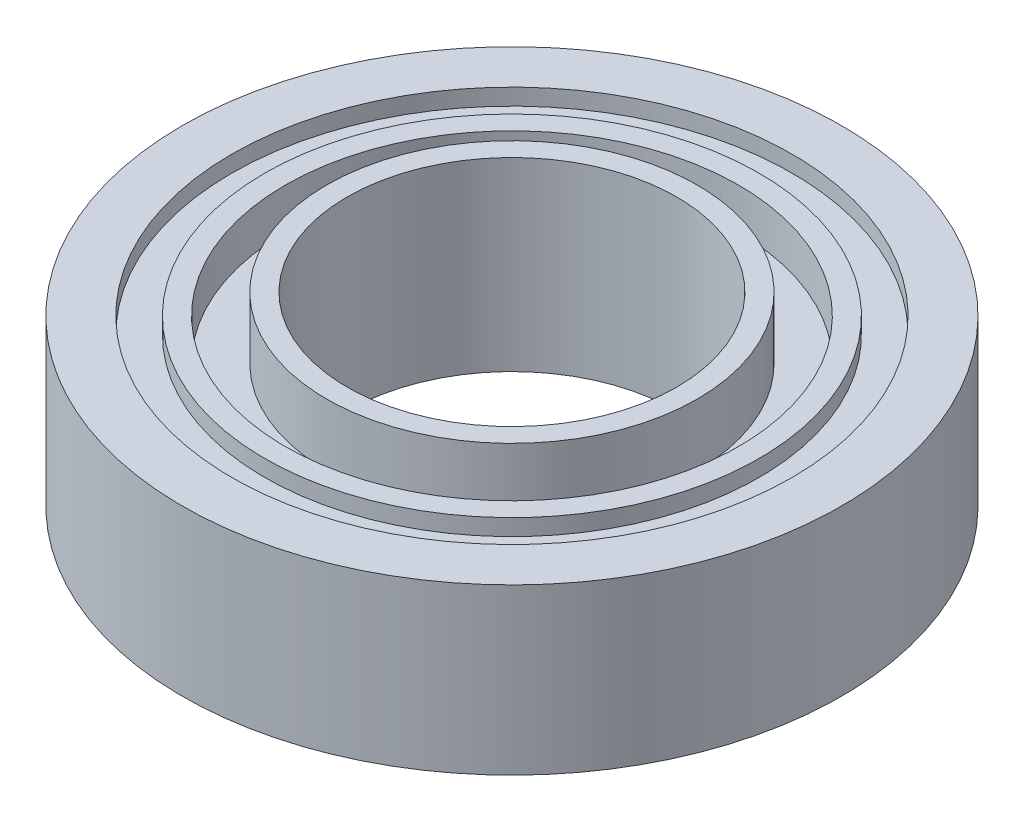
ISO-10303-21;
HEADER;
FILE_DESCRIPTION(('STEP AP214'),'2;1');
FILE_NAME('part.step','',(''),(''),'','','');
FILE_SCHEMA(('AUTOMOTIVE_DESIGN { 1 0 10303 214 1 1 1 1 }'));
ENDSEC;
DATA;
#1=APPLICATION_CONTEXT('core data for automotive mechanical design processes');
#2=APPLICATION_PROTOCOL_DEFINITION('international standard','automotive_design',2000,#1);
#3=PRODUCT_CONTEXT('',#1,'mechanical');
#4=PRODUCT('Part','Part','',(#3));
#5=PRODUCT_RELATED_PRODUCT_CATEGORY('part','',(#4));
#6=PRODUCT_DEFINITION_FORMATION('','',#4);
#7=PRODUCT_DEFINITION_CONTEXT('part definition',#1,'design');
#8=PRODUCT_DEFINITION('design','',#6,#7);
#9=PRODUCT_DEFINITION_SHAPE('','',#8);
#10=(LENGTH_UNIT() NAMED_UNIT(*) SI_UNIT(.MILLI.,.METRE.));
#11=(NAMED_UNIT(*) PLANE_ANGLE_UNIT() SI_UNIT($,.RADIAN.));
#12=(NAMED_UNIT(*) SI_UNIT($,.STERADIAN.) SOLID_ANGLE_UNIT());
#13=UNCERTAINTY_MEASURE_WITH_UNIT(LENGTH_MEASURE(1.E-05),#10,'distance_accuracy_value','');
#14=(GEOMETRIC_REPRESENTATION_CONTEXT(3) GLOBAL_UNCERTAINTY_ASSIGNED_CONTEXT((#13)) GLOBAL_UNIT_ASSIGNED_CONTEXT((#10,
#11,#12)) REPRESENTATION_CONTEXT('',''));
#15=CARTESIAN_POINT('',(0.,0.,0.));
#16=DIRECTION('',(0.,0.,1.));
#17=DIRECTION('',(1.,0.,0.));
#18=AXIS2_PLACEMENT_3D('',#15,#16,#17);
#19=CARTESIAN_POINT('',(17.78,-25.4,0.));
#20=DIRECTION('',(0.,-1.,0.));
#21=DIRECTION('',(1.,0.,0.));
#22=AXIS2_PLACEMENT_3D('',#19,#20,#21);
#23=PLANE('',#22);
#24=CARTESIAN_POINT('',(76.2,-25.4,0.));
#25=DIRECTION('',(0.,1.,0.));
#26=DIRECTION('',(-1.,0.,0.));
#27=AXIS2_PLACEMENT_3D('',#24,#25,#26);
#28=CIRCLE('',#27,50.8);
#29=CARTESIAN_POINT('',(25.4,-25.4,0.));
#30=VERTEX_POINT('',#29);
#31=EDGE_CURVE('E87',#30,#30,#28,.T.);
#32=ORIENTED_EDGE('',*,*,#31,.T.);
#33=EDGE_LOOP('',(#32));
#34=FACE_BOUND('',#33,.T.);
#35=CARTESIAN_POINT('',(76.2,-25.4,0.));
#36=DIRECTION('',(0.,1.,0.));
#37=DIRECTION('',(-1.,0.,0.));
#38=AXIS2_PLACEMENT_3D('',#35,#36,#37);
#39=CIRCLE('',#38,58.42);
#40=CARTESIAN_POINT('',(17.78,-25.4,0.));
#41=VERTEX_POINT('',#40);
#42=EDGE_CURVE('E10',#41,#41,#39,.T.);
#43=ORIENTED_EDGE('',*,*,#42,.F.);
#44=EDGE_LOOP('',(#43));
#45=FACE_BOUND('',#44,.T.);
#46=ADVANCED_FACE('F35',(#34,#45),#23,.T.);
#47=CARTESIAN_POINT('',(76.2,-1.30390900990038,0.));
#48=DIRECTION('',(0.,1.,0.));
#49=DIRECTION('',(-1.,0.,0.));
#50=AXIS2_PLACEMENT_3D('',#47,#48,#49);
#51=CYLINDRICAL_SURFACE('',#50,58.42);
#52=ORIENTED_EDGE('',*,*,#42,.T.);
#53=EDGE_LOOP('',(#52));
#54=FACE_BOUND('',#53,.T.);
#55=CARTESIAN_POINT('',(76.2,-20.32,0.));
#56=DIRECTION('',(0.,1.,0.));
#57=DIRECTION('',(-1.,0.,0.));
#58=AXIS2_PLACEMENT_3D('',#55,#56,#57);
#59=CIRCLE('',#58,58.42);
#60=CARTESIAN_POINT('',(17.78,-20.32,0.));
#61=VERTEX_POINT('',#60);
#62=EDGE_CURVE('E41',#61,#61,#59,.T.);
#63=ORIENTED_EDGE('',*,*,#62,.F.);
#64=EDGE_LOOP('',(#63));
#65=FACE_BOUND('',#64,.T.);
#66=ADVANCED_FACE('F105',(#54,#65),#51,.T.);
#67=CARTESIAN_POINT('',(7.61999999999999,-20.32,0.));
#68=DIRECTION('',(0.,-1.,0.));
#69=DIRECTION('',(1.,0.,0.));
#70=AXIS2_PLACEMENT_3D('',#67,#68,#69);
#71=PLANE('',#70);
#72=ORIENTED_EDGE('',*,*,#62,.T.);
#73=EDGE_LOOP('',(#72));
#74=FACE_BOUND('',#73,.T.);
#75=CARTESIAN_POINT('',(76.2,-20.32,0.));
#76=DIRECTION('',(0.,1.,0.));
#77=DIRECTION('',(-1.,0.,0.));
#78=AXIS2_PLACEMENT_3D('',#75,#76,#77);
#79=CIRCLE('',#78,68.58);
#80=CARTESIAN_POINT('',(7.61999999999999,-20.32,0.));
#81=VERTEX_POINT('',#80);
#82=EDGE_CURVE('E45',#81,#81,#79,.T.);
#83=ORIENTED_EDGE('',*,*,#82,.F.);
#84=EDGE_LOOP('',(#83));
#85=FACE_BOUND('',#84,.T.);
#86=ADVANCED_FACE('F109',(#74,#85),#71,.T.);
#87=CARTESIAN_POINT('',(76.2,-1.30390900990038,0.));
#88=DIRECTION('',(0.,1.,0.));
#89=DIRECTION('',(-1.,0.,0.));
#90=AXIS2_PLACEMENT_3D('',#87,#88,#89);
#91=CYLINDRICAL_SURFACE('',#90,68.58);
#92=ORIENTED_EDGE('',*,*,#82,.T.);
#93=EDGE_LOOP('',(#92));
#94=FACE_BOUND('',#93,.T.);
#95=CARTESIAN_POINT('',(76.2,-25.4,0.));
#96=DIRECTION('',(0.,1.,0.));
#97=DIRECTION('',(-1.,0.,0.));
#98=AXIS2_PLACEMENT_3D('',#95,#96,#97);
#99=CIRCLE('',#98,68.58);
#100=CARTESIAN_POINT('',(7.62,-25.4,0.));
#101=VERTEX_POINT('',#100);
#102=EDGE_CURVE('E49',#101,#101,#99,.T.);
#103=ORIENTED_EDGE('',*,*,#102,.F.);
#104=EDGE_LOOP('',(#103));
#105=FACE_BOUND('',#104,.T.);
#106=ADVANCED_FACE('F113',(#94,#105),#91,.F.);
#107=CARTESIAN_POINT('',(-25.4,-25.4,0.));
#108=DIRECTION('',(0.,-1.,0.));
#109=DIRECTION('',(1.,0.,0.));
#110=AXIS2_PLACEMENT_3D('',#107,#108,#109);
#111=PLANE('',#110);
#112=ORIENTED_EDGE('',*,*,#102,.T.);
#113=EDGE_LOOP('',(#112));
#114=FACE_BOUND('',#113,.T.);
#115=CARTESIAN_POINT('',(76.2,-25.4,0.));
#116=DIRECTION('',(0.,1.,0.));
#117=DIRECTION('',(-1.,0.,0.));
#118=AXIS2_PLACEMENT_3D('',#115,#116,#117);
#119=CIRCLE('',#118,101.6);
#120=CARTESIAN_POINT('',(-25.4,-25.4,0.));
#121=VERTEX_POINT('',#120);
#122=EDGE_CURVE('E54',#121,#121,#119,.T.);
#123=ORIENTED_EDGE('',*,*,#122,.F.);
#124=EDGE_LOOP('',(#123));
#125=FACE_BOUND('',#124,.T.);
#126=ADVANCED_FACE('F119',(#114,#125),#111,.T.);
#127=CARTESIAN_POINT('',(76.2,-1.30390900990038,0.));
#128=DIRECTION('',(0.,1.,0.));
#129=DIRECTION('',(-1.,0.,0.));
#130=AXIS2_PLACEMENT_3D('',#127,#128,#129);
#131=CYLINDRICAL_SURFACE('',#130,101.6);
#132=ORIENTED_EDGE('',*,*,#122,.T.);
#133=EDGE_LOOP('',(#132));
#134=FACE_BOUND('',#133,.T.);
#135=CARTESIAN_POINT('',(76.2,25.4,0.));
#136=DIRECTION('',(0.,1.,0.));
#137=DIRECTION('',(-1.,0.,0.));
#138=AXIS2_PLACEMENT_3D('',#135,#136,#137);
#139=CIRCLE('',#138,101.6);
#140=CARTESIAN_POINT('',(-25.4,25.4,0.));
#141=VERTEX_POINT('',#140);
#142=EDGE_CURVE('E57',#141,#141,#139,.T.);
#143=ORIENTED_EDGE('',*,*,#142,.F.);
#144=EDGE_LOOP('',(#143));
#145=FACE_BOUND('',#144,.T.);
#146=ADVANCED_FACE('F123',(#134,#145),#131,.T.);
#147=CARTESIAN_POINT('',(-25.4,25.4,0.));
#148=DIRECTION('',(0.,1.,0.));
#149=DIRECTION('',(-1.,0.,0.));
#150=AXIS2_PLACEMENT_3D('',#147,#148,#149);
#151=PLANE('',#150);
#152=ORIENTED_EDGE('',*,*,#142,.T.);
#153=EDGE_LOOP('',(#152));
#154=FACE_BOUND('',#153,.T.);
#155=CARTESIAN_POINT('',(76.2,25.4,0.));
#156=DIRECTION('',(0.,1.,0.));
#157=DIRECTION('',(-1.,0.,0.));
#158=AXIS2_PLACEMENT_3D('',#155,#156,#157);
#159=CIRCLE('',#158,86.36);
#160=CARTESIAN_POINT('',(-10.16,25.4,0.));
#161=VERTEX_POINT('',#160);
#162=EDGE_CURVE('E60',#161,#161,#159,.T.);
#163=ORIENTED_EDGE('',*,*,#162,.F.);
#164=EDGE_LOOP('',(#163));
#165=FACE_BOUND('',#164,.T.);
#166=ADVANCED_FACE('F127',(#154,#165),#151,.T.);
#167=CARTESIAN_POINT('',(76.2,-1.30390900990038,0.));
#168=DIRECTION('',(0.,1.,0.));
#169=DIRECTION('',(-1.,0.,0.));
#170=AXIS2_PLACEMENT_3D('',#167,#168,#169);
#171=CYLINDRICAL_SURFACE('',#170,86.36);
#172=ORIENTED_EDGE('',*,*,#162,.T.);
#173=EDGE_LOOP('',(#172));
#174=FACE_BOUND('',#173,.T.);
#175=CARTESIAN_POINT('',(76.2,20.32,0.));
#176=DIRECTION('',(0.,1.,0.));
#177=DIRECTION('',(-1.,0.,0.));
#178=AXIS2_PLACEMENT_3D('',#175,#176,#177);
#179=CIRCLE('',#178,86.36);
#180=CARTESIAN_POINT('',(-10.16,20.32,0.));
#181=VERTEX_POINT('',#180);
#182=EDGE_CURVE('E63',#181,#181,#179,.T.);
#183=ORIENTED_EDGE('',*,*,#182,.F.);
#184=EDGE_LOOP('',(#183));
#185=FACE_BOUND('',#184,.T.);
#186=ADVANCED_FACE('F131',(#174,#185),#171,.F.);
#187=CARTESIAN_POINT('',(-10.16,20.32,0.));
#188=DIRECTION('',(0.,1.,0.));
#189=DIRECTION('',(-1.,0.,0.));
#190=AXIS2_PLACEMENT_3D('',#187,#188,#189);
#191=PLANE('',#190);
#192=ORIENTED_EDGE('',*,*,#182,.T.);
#193=EDGE_LOOP('',(#192));
#194=FACE_BOUND('',#193,.T.);
#195=CARTESIAN_POINT('',(76.2,20.32,0.));
#196=DIRECTION('',(0.,1.,0.));
#197=DIRECTION('',(-1.,0.,0.));
#198=AXIS2_PLACEMENT_3D('',#195,#196,#197);
#199=CIRCLE('',#198,76.2);
#200=CARTESIAN_POINT('',(0.,20.32,0.));
#201=VERTEX_POINT('',#200);
#202=EDGE_CURVE('E66',#201,#201,#199,.T.);
#203=ORIENTED_EDGE('',*,*,#202,.F.);
#204=EDGE_LOOP('',(#203));
#205=FACE_BOUND('',#204,.T.);
#206=ADVANCED_FACE('F135',(#194,#205),#191,.T.);
#207=CARTESIAN_POINT('',(76.2,-1.30390900990038,0.));
#208=DIRECTION('',(0.,1.,0.));
#209=DIRECTION('',(-1.,0.,0.));
#210=AXIS2_PLACEMENT_3D('',#207,#208,#209);
#211=CYLINDRICAL_SURFACE('',#210,76.2);
#212=ORIENTED_EDGE('',*,*,#202,.T.);
#213=EDGE_LOOP('',(#212));
#214=FACE_BOUND('',#213,.T.);
#215=CARTESIAN_POINT('',(76.2,25.4,0.));
#216=DIRECTION('',(0.,1.,0.));
#217=DIRECTION('',(-1.,0.,0.));
#218=AXIS2_PLACEMENT_3D('',#215,#216,#217);
#219=CIRCLE('',#218,76.2);
#220=CARTESIAN_POINT('',(0.,25.4,0.));
#221=VERTEX_POINT('',#220);
#222=EDGE_CURVE('E69',#221,#221,#219,.T.);
#223=ORIENTED_EDGE('',*,*,#222,.F.);
#224=EDGE_LOOP('',(#223));
#225=FACE_BOUND('',#224,.T.);
#226=ADVANCED_FACE('F139',(#214,#225),#211,.T.);
#227=CARTESIAN_POINT('',(0.,25.4,0.));
#228=DIRECTION('',(0.,1.,0.));
#229=DIRECTION('',(-1.,0.,0.));
#230=AXIS2_PLACEMENT_3D('',#227,#228,#229);
#231=PLANE('',#230);
#232=ORIENTED_EDGE('',*,*,#222,.T.);
#233=EDGE_LOOP('',(#232));
#234=FACE_BOUND('',#233,.T.);
#235=CARTESIAN_POINT('',(76.2,25.4,0.));
#236=DIRECTION('',(0.,1.,0.));
#237=DIRECTION('',(-1.,0.,0.));
#238=AXIS2_PLACEMENT_3D('',#235,#236,#237);
#239=CIRCLE('',#238,69.85);
#240=CARTESIAN_POINT('',(6.34999999999998,25.4,0.));
#241=VERTEX_POINT('',#240);
#242=EDGE_CURVE('E72',#241,#241,#239,.T.);
#243=ORIENTED_EDGE('',*,*,#242,.F.);
#244=EDGE_LOOP('',(#243));
#245=FACE_BOUND('',#244,.T.);
#246=ADVANCED_FACE('F143',(#234,#245),#231,.T.);
#247=CARTESIAN_POINT('',(76.2,-1.30390900990038,0.));
#248=DIRECTION('',(0.,1.,0.));
#249=DIRECTION('',(-1.,0.,0.));
#250=AXIS2_PLACEMENT_3D('',#247,#248,#249);
#251=CYLINDRICAL_SURFACE('',#250,69.85);
#252=ORIENTED_EDGE('',*,*,#242,.T.);
#253=EDGE_LOOP('',(#252));
#254=FACE_BOUND('',#253,.T.);
#255=CARTESIAN_POINT('',(76.2,12.7,0.));
#256=DIRECTION('',(0.,1.,0.));
#257=DIRECTION('',(-1.,0.,0.));
#258=AXIS2_PLACEMENT_3D('',#255,#256,#257);
#259=CIRCLE('',#258,69.85);
#260=CARTESIAN_POINT('',(6.34999999999998,12.7,0.));
#261=VERTEX_POINT('',#260);
#262=EDGE_CURVE('E75',#261,#261,#259,.T.);
#263=ORIENTED_EDGE('',*,*,#262,.F.);
#264=EDGE_LOOP('',(#263));
#265=FACE_BOUND('',#264,.T.);
#266=ADVANCED_FACE('F147',(#254,#265),#251,.F.);
#267=CARTESIAN_POINT('',(6.34999999999999,12.7,0.));
#268=DIRECTION('',(0.,1.,0.));
#269=DIRECTION('',(-1.,0.,0.));
#270=AXIS2_PLACEMENT_3D('',#267,#268,#269);
#271=PLANE('',#270);
#272=ORIENTED_EDGE('',*,*,#262,.T.);
#273=EDGE_LOOP('',(#272));
#274=FACE_BOUND('',#273,.T.);
#275=CARTESIAN_POINT('',(76.2,12.7,0.));
#276=DIRECTION('',(0.,1.,0.));
#277=DIRECTION('',(-1.,0.,0.));
#278=AXIS2_PLACEMENT_3D('',#275,#276,#277);
#279=CIRCLE('',#278,57.15);
#280=CARTESIAN_POINT('',(19.05,12.7,0.));
#281=VERTEX_POINT('',#280);
#282=EDGE_CURVE('E78',#281,#281,#279,.T.);
#283=ORIENTED_EDGE('',*,*,#282,.F.);
#284=EDGE_LOOP('',(#283));
#285=FACE_BOUND('',#284,.T.);
#286=ADVANCED_FACE('F151',(#274,#285),#271,.T.);
#287=CARTESIAN_POINT('',(76.2,-1.30390900990038,0.));
#288=DIRECTION('',(0.,1.,0.));
#289=DIRECTION('',(-1.,0.,0.));
#290=AXIS2_PLACEMENT_3D('',#287,#288,#289);
#291=CYLINDRICAL_SURFACE('',#290,57.15);
#292=ORIENTED_EDGE('',*,*,#282,.T.);
#293=EDGE_LOOP('',(#292));
#294=FACE_BOUND('',#293,.T.);
#295=CARTESIAN_POINT('',(76.2,31.75,0.));
#296=DIRECTION('',(0.,1.,0.));
#297=DIRECTION('',(-1.,0.,0.));
#298=AXIS2_PLACEMENT_3D('',#295,#296,#297);
#299=CIRCLE('',#298,57.15);
#300=CARTESIAN_POINT('',(19.05,31.75,0.));
#301=VERTEX_POINT('',#300);
#302=EDGE_CURVE('E81',#301,#301,#299,.T.);
#303=ORIENTED_EDGE('',*,*,#302,.F.);
#304=EDGE_LOOP('',(#303));
#305=FACE_BOUND('',#304,.T.);
#306=ADVANCED_FACE('F101',(#294,#305),#291,.T.);
#307=CARTESIAN_POINT('',(19.05,31.75,0.));
#308=DIRECTION('',(0.,1.,0.));
#309=DIRECTION('',(-1.,0.,0.));
#310=AXIS2_PLACEMENT_3D('',#307,#308,#309);
#311=PLANE('',#310);
#312=ORIENTED_EDGE('',*,*,#302,.T.);
#313=EDGE_LOOP('',(#312));
#314=FACE_BOUND('',#313,.T.);
#315=CARTESIAN_POINT('',(76.2,31.75,0.));
#316=DIRECTION('',(0.,1.,0.));
#317=DIRECTION('',(-1.,0.,0.));
#318=AXIS2_PLACEMENT_3D('',#315,#316,#317);
#319=CIRCLE('',#318,50.8);
#320=CARTESIAN_POINT('',(25.4,31.75,0.));
#321=VERTEX_POINT('',#320);
#322=EDGE_CURVE('E84',#321,#321,#319,.T.);
#323=ORIENTED_EDGE('',*,*,#322,.F.);
#324=EDGE_LOOP('',(#323));
#325=FACE_BOUND('',#324,.T.);
#326=ADVANCED_FACE('F95',(#314,#325),#311,.T.);
#327=CARTESIAN_POINT('',(76.2,-1.30390900990038,0.));
#328=DIRECTION('',(0.,1.,0.));
#329=DIRECTION('',(-1.,0.,0.));
#330=AXIS2_PLACEMENT_3D('',#327,#328,#329);
#331=CYLINDRICAL_SURFACE('',#330,50.8);
#332=ORIENTED_EDGE('',*,*,#322,.T.);
#333=EDGE_LOOP('',(#332));
#334=FACE_BOUND('',#333,.T.);
#335=ORIENTED_EDGE('',*,*,#31,.F.);
#336=EDGE_LOOP('',(#335));
#337=FACE_BOUND('',#336,.T.);
#338=ADVANCED_FACE('F93',(#334,#337),#331,.F.);
#339=CLOSED_SHELL('',(#46,#66,#86,#106,#126,#146,#166,#186,#206,#226,#246,#266,#286,#306,#326,#338));
#340=MANIFOLD_SOLID_BREP('B2',#339);
#341=ADVANCED_BREP_SHAPE_REPRESENTATION('',(#18,#340),#14);
#342=SHAPE_DEFINITION_REPRESENTATION(#9,#341);
ENDSEC;
END-ISO-10303-21;
